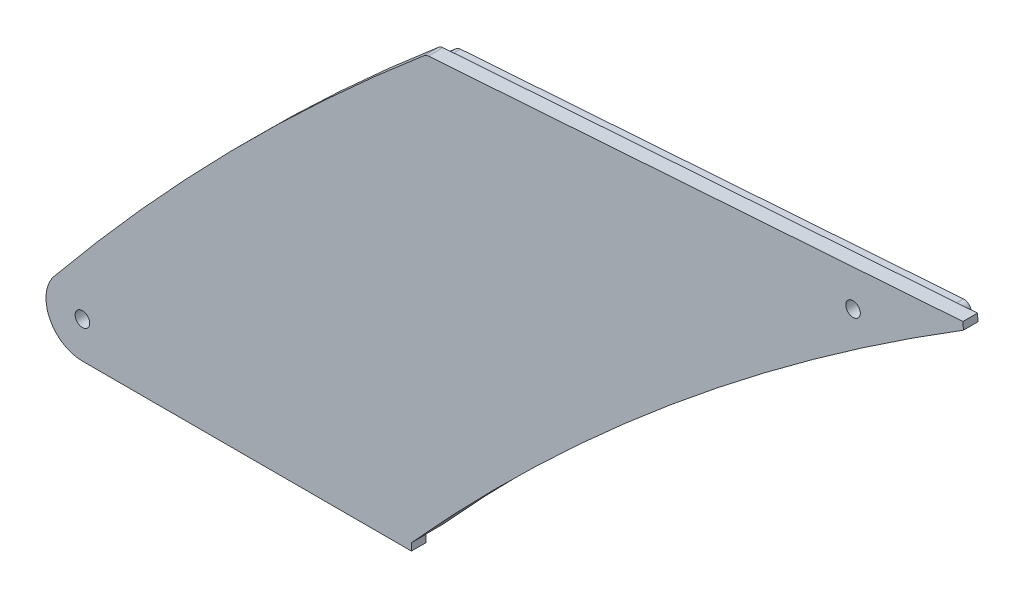
ISO-10303-21;
HEADER;
FILE_DESCRIPTION(('STEP AP214'),'2;1');
FILE_NAME('part.step','',(''),(''),'','','');
FILE_SCHEMA(('AUTOMOTIVE_DESIGN { 1 0 10303 214 1 1 1 1 }'));
ENDSEC;
DATA;
#1=APPLICATION_CONTEXT('core data for automotive mechanical design processes');
#2=APPLICATION_PROTOCOL_DEFINITION('international standard','automotive_design',2000,#1);
#3=PRODUCT_CONTEXT('',#1,'mechanical');
#4=PRODUCT('Part','Part','',(#3));
#5=PRODUCT_RELATED_PRODUCT_CATEGORY('part','',(#4));
#6=PRODUCT_DEFINITION_FORMATION('','',#4);
#7=PRODUCT_DEFINITION_CONTEXT('part definition',#1,'design');
#8=PRODUCT_DEFINITION('design','',#6,#7);
#9=PRODUCT_DEFINITION_SHAPE('','',#8);
#10=(LENGTH_UNIT() NAMED_UNIT(*) SI_UNIT(.MILLI.,.METRE.));
#11=(NAMED_UNIT(*) PLANE_ANGLE_UNIT() SI_UNIT($,.RADIAN.));
#12=(NAMED_UNIT(*) SI_UNIT($,.STERADIAN.) SOLID_ANGLE_UNIT());
#13=UNCERTAINTY_MEASURE_WITH_UNIT(LENGTH_MEASURE(1.E-05),#10,'distance_accuracy_value','');
#14=(GEOMETRIC_REPRESENTATION_CONTEXT(3) GLOBAL_UNCERTAINTY_ASSIGNED_CONTEXT((#13)) GLOBAL_UNIT_ASSIGNED_CONTEXT((#10,
#11,#12)) REPRESENTATION_CONTEXT('',''));
#15=CARTESIAN_POINT('',(0.,0.,0.));
#16=DIRECTION('',(0.,0.,1.));
#17=DIRECTION('',(1.,0.,0.));
#18=AXIS2_PLACEMENT_3D('',#15,#16,#17);
#19=CARTESIAN_POINT('',(-2.4436486294126,-58.,2.));
#20=DIRECTION('',(0.,0.,1.));
#21=DIRECTION('',(1.,0.,0.));
#22=AXIS2_PLACEMENT_3D('',#19,#20,#21);
#23=PLANE('',#22);
#24=CARTESIAN_POINT('',(-2.4436486294126,-58.,2.));
#25=DIRECTION('',(0.,0.,1.));
#26=DIRECTION('',(1.,0.,0.));
#27=AXIS2_PLACEMENT_3D('',#24,#25,#26);
#28=CIRCLE('',#27,1.00000000000001);
#29=CARTESIAN_POINT('',(-2.4436486294126,-59.,2.));
#30=VERTEX_POINT('',#29);
#31=CARTESIAN_POINT('',(-1.70269549343666,-58.6715567364619,2.));
#32=VERTEX_POINT('',#31);
#33=EDGE_CURVE('E255',#30,#32,#28,.T.);
#34=ORIENTED_EDGE('',*,*,#33,.F.);
#35=DIRECTION('',(1.,0.,0.));
#36=VECTOR('',#35,1.);
#37=CARTESIAN_POINT('',(-47.1687635097815,-59.,2.));
#38=LINE('',#37,#36);
#39=CARTESIAN_POINT('',(-47.1687635097815,-59.,2.));
#40=VERTEX_POINT('',#39);
#41=EDGE_CURVE('E260',#40,#30,#38,.T.);
#42=ORIENTED_EDGE('',*,*,#41,.F.);
#43=CARTESIAN_POINT('',(-47.1687635097815,-55.,2.));
#44=DIRECTION('',(0.,0.,1.));
#45=DIRECTION('',(1.,0.,0.));
#46=AXIS2_PLACEMENT_3D('',#43,#44,#45);
#47=CIRCLE('',#46,4.00000000000002);
#48=CARTESIAN_POINT('',(-50.26232758474,-52.4642828797111,2.));
#49=VERTEX_POINT('',#48);
#50=EDGE_CURVE('E291',#49,#40,#47,.T.);
#51=ORIENTED_EDGE('',*,*,#50,.F.);
#52=CARTESIAN_POINT('',(258.320688892371,-305.402065628526,2.));
#53=DIRECTION('',(0.,0.,1.));
#54=DIRECTION('',(1.,0.,0.));
#55=AXIS2_PLACEMENT_3D('',#52,#53,#54);
#56=CIRCLE('',#55,399.);
#57=CARTESIAN_POINT('',(0.145969905223198,-1.18698632457875,2.));
#58=VERTEX_POINT('',#57);
#59=EDGE_CURVE('E289',#58,#49,#56,.T.);
#60=ORIENTED_EDGE('',*,*,#59,.F.);
#61=CARTESIAN_POINT('',(0.7930243387749,-1.94943013235809,2.));
#62=DIRECTION('',(0.,0.,1.));
#63=DIRECTION('',(1.,0.,0.));
#64=AXIS2_PLACEMENT_3D('',#61,#62,#63);
#65=CIRCLE('',#64,0.999999999999972);
#66=CARTESIAN_POINT('',(0.723267865030791,-0.951866082098294,2.));
#67=VERTEX_POINT('',#66);
#68=EDGE_CURVE('E287',#67,#58,#65,.T.);
#69=ORIENTED_EDGE('',*,*,#68,.F.);
#70=DIRECTION('',(-0.997564050259824,-0.069756473744126,0.));
#71=VECTOR('',#70,1.);
#72=CARTESIAN_POINT('',(69.7934844215764,3.87799396194877,2.));
#73=LINE('',#72,#71);
#74=CARTESIAN_POINT('',(69.7934844215764,3.87799396194877,2.));
#75=VERTEX_POINT('',#74);
#76=EDGE_CURVE('E285',#75,#67,#73,.T.);
#77=ORIENTED_EDGE('',*,*,#76,.F.);
#78=CARTESIAN_POINT('',(69.8632408953205,2.88042991168902,2.));
#79=DIRECTION('',(0.,0.,1.));
#80=DIRECTION('',(1.,0.,0.));
#81=AXIS2_PLACEMENT_3D('',#78,#79,#80);
#82=CIRCLE('',#81,0.999999999999983);
#83=CARTESIAN_POINT('',(70.3987767315104,2.03591740843259,2.));
#84=VERTEX_POINT('',#83);
#85=EDGE_CURVE('E283',#84,#75,#82,.T.);
#86=ORIENTED_EDGE('',*,*,#85,.F.);
#87=CARTESIAN_POINT('',(258.371855234146,-294.387971234575,2.));
#88=DIRECTION('',(0.,0.,-1.));
#89=DIRECTION('',(1.,0.,0.));
#90=AXIS2_PLACEMENT_3D('',#87,#88,#89);
#91=CIRCLE('',#90,351.);
#92=EDGE_CURVE('E281',#32,#84,#91,.T.);
#93=ORIENTED_EDGE('',*,*,#92,.F.);
#94=EDGE_LOOP('',(#34,#42,#51,#60,#69,#77,#86,#93));
#95=FACE_BOUND('',#94,.T.);
#96=CARTESIAN_POINT('',(258.371855234146,-294.387971234575,2.));
#97=DIRECTION('',(0.,0.,-1.));
#98=DIRECTION('',(1.,0.,0.));
#99=AXIS2_PLACEMENT_3D('',#96,#97,#98);
#100=CIRCLE('',#99,352.);
#101=CARTESIAN_POINT('',(-1.85015545632594,-57.3468246962405,2.));
#102=VERTEX_POINT('',#101);
#103=CARTESIAN_POINT('',(63.3983515075853,-1.31915193680487,2.));
#104=VERTEX_POINT('',#103);
#105=EDGE_CURVE('E230',#102,#104,#100,.T.);
#106=ORIENTED_EDGE('',*,*,#105,.T.);
#107=CARTESIAN_POINT('',(62.290547509139,0.346011809205182,2.));
#108=DIRECTION('',(0.,0.,1.));
#109=DIRECTION('',(1.,0.,0.));
#110=AXIS2_PLACEMENT_3D('',#107,#108,#109);
#111=CIRCLE('',#110,2.);
#112=CARTESIAN_POINT('',(62.1510345616507,2.34113990972488,2.));
#113=VERTEX_POINT('',#112);
#114=EDGE_CURVE('E11',#104,#113,#111,.T.);
#115=ORIENTED_EDGE('',*,*,#114,.T.);
#116=DIRECTION('',(-0.997564050259824,-0.0697564737441236,0.));
#117=VECTOR('',#116,1.);
#118=CARTESIAN_POINT('',(69.8632408953205,2.88042991168895,2.));
#119=LINE('',#118,#117);
#120=CARTESIAN_POINT('',(1.44835692424686,-1.90360481389329,2.));
#121=VERTEX_POINT('',#120);
#122=EDGE_CURVE('E218',#113,#121,#119,.T.);
#123=ORIENTED_EDGE('',*,*,#122,.T.);
#124=CARTESIAN_POINT('',(1.58786987173512,-3.898732914413,2.));
#125=DIRECTION('',(0.,0.,1.));
#126=DIRECTION('',(1.,0.,0.));
#127=AXIS2_PLACEMENT_3D('',#124,#125,#126);
#128=CIRCLE('',#127,2.);
#129=CARTESIAN_POINT('',(0.291239472641036,-2.37598880979623,2.));
#130=VERTEX_POINT('',#129);
#131=EDGE_CURVE('E41',#121,#130,#128,.T.);
#132=ORIENTED_EDGE('',*,*,#131,.T.);
#133=CARTESIAN_POINT('',(258.320688892371,-305.402065628526,2.));
#134=DIRECTION('',(0.,0.,1.));
#135=DIRECTION('',(1.,0.,0.));
#136=AXIS2_PLACEMENT_3D('',#133,#134,#135);
#137=CIRCLE('',#136,398.);
#138=CARTESIAN_POINT('',(-49.4889365660004,-53.0982121597833,2.));
#139=VERTEX_POINT('',#138);
#140=EDGE_CURVE('E220',#130,#139,#137,.T.);
#141=ORIENTED_EDGE('',*,*,#140,.T.);
#142=CARTESIAN_POINT('',(-47.1687635097815,-55.,2.));
#143=DIRECTION('',(0.,0.,1.));
#144=DIRECTION('',(1.,0.,0.));
#145=AXIS2_PLACEMENT_3D('',#142,#143,#144);
#146=CIRCLE('',#145,3.00000000000002);
#147=CARTESIAN_POINT('',(-47.1687635097815,-58.,2.));
#148=VERTEX_POINT('',#147);
#149=EDGE_CURVE('E243',#139,#148,#146,.T.);
#150=ORIENTED_EDGE('',*,*,#149,.T.);
#151=DIRECTION('',(1.,0.,0.));
#152=VECTOR('',#151,1.);
#153=CARTESIAN_POINT('',(-47.1687635097815,-58.,2.));
#154=LINE('',#153,#152);
#155=CARTESIAN_POINT('',(-3.32868960797633,-58.,2.));
#156=VERTEX_POINT('',#155);
#157=EDGE_CURVE('E246',#148,#156,#154,.T.);
#158=ORIENTED_EDGE('',*,*,#157,.T.);
#159=CARTESIAN_POINT('',(-3.32868960797633,-56.,2.));
#160=DIRECTION('',(0.,0.,1.));
#161=DIRECTION('',(1.,0.,0.));
#162=AXIS2_PLACEMENT_3D('',#159,#160,#161);
#163=CIRCLE('',#162,2.);
#164=EDGE_CURVE('E337',#156,#102,#163,.T.);
#165=ORIENTED_EDGE('',*,*,#164,.T.);
#166=EDGE_LOOP('',(#106,#115,#123,#132,#141,#150,#158,#165));
#167=FACE_BOUND('',#166,.T.);
#168=ADVANCED_FACE('F33',(#95,#167),#23,.F.);
#169=CARTESIAN_POINT('',(-2.4436486294126,-58.,4.));
#170=DIRECTION('',(0.,0.,-1.));
#171=DIRECTION('',(-1.,0.,0.));
#172=AXIS2_PLACEMENT_3D('',#169,#170,#171);
#173=CYLINDRICAL_SURFACE('',#172,1.00000000000001);
#174=ORIENTED_EDGE('',*,*,#33,.T.);
#175=DIRECTION('',(0.,0.,-1.));
#176=VECTOR('',#175,1.);
#177=CARTESIAN_POINT('',(-1.70269549343666,-58.6715567364619,4.));
#178=LINE('',#177,#176);
#179=CARTESIAN_POINT('',(-1.70269549343666,-58.6715567364619,4.));
#180=VERTEX_POINT('',#179);
#181=EDGE_CURVE('E314',#180,#32,#178,.T.);
#182=ORIENTED_EDGE('',*,*,#181,.F.);
#183=CARTESIAN_POINT('',(-2.4436486294126,-58.,4.));
#184=DIRECTION('',(0.,0.,1.));
#185=DIRECTION('',(1.,0.,0.));
#186=AXIS2_PLACEMENT_3D('',#183,#184,#185);
#187=CIRCLE('',#186,1.00000000000001);
#188=CARTESIAN_POINT('',(-2.4436486294126,-59.,4.));
#189=VERTEX_POINT('',#188);
#190=EDGE_CURVE('E256',#189,#180,#187,.T.);
#191=ORIENTED_EDGE('',*,*,#190,.F.);
#192=DIRECTION('',(0.,0.,-1.));
#193=VECTOR('',#192,1.);
#194=CARTESIAN_POINT('',(-2.4436486294126,-59.,4.));
#195=LINE('',#194,#193);
#196=EDGE_CURVE('E278',#189,#30,#195,.T.);
#197=ORIENTED_EDGE('',*,*,#196,.T.);
#198=EDGE_LOOP('',(#174,#182,#191,#197));
#199=FACE_BOUND('',#198,.T.);
#200=ADVANCED_FACE('F375',(#199),#173,.T.);
#201=CARTESIAN_POINT('',(258.371855234146,-294.387971234575,4.));
#202=DIRECTION('',(0.,0.,-1.));
#203=DIRECTION('',(-1.,0.,0.));
#204=AXIS2_PLACEMENT_3D('',#201,#202,#203);
#205=CYLINDRICAL_SURFACE('',#204,351.);
#206=ORIENTED_EDGE('',*,*,#92,.T.);
#207=DIRECTION('',(0.,0.,-1.));
#208=VECTOR('',#207,1.);
#209=CARTESIAN_POINT('',(70.3987767315104,2.03591740843259,4.));
#210=LINE('',#209,#208);
#211=CARTESIAN_POINT('',(70.3987767315104,2.03591740843259,4.));
#212=VERTEX_POINT('',#211);
#213=EDGE_CURVE('E311',#212,#84,#210,.T.);
#214=ORIENTED_EDGE('',*,*,#213,.F.);
#215=CARTESIAN_POINT('',(258.371855234146,-294.387971234575,4.));
#216=DIRECTION('',(0.,0.,-1.));
#217=DIRECTION('',(1.,0.,0.));
#218=AXIS2_PLACEMENT_3D('',#215,#216,#217);
#219=CIRCLE('',#218,351.);
#220=CARTESIAN_POINT('',(73.7864397832826,4.15720860062557,4.));
#221=VERTEX_POINT('',#220);
#222=EDGE_CURVE('E675',#212,#221,#219,.T.);
#223=ORIENTED_EDGE('',*,*,#222,.T.);
#224=DIRECTION('',(0.,0.,-1.));
#225=VECTOR('',#224,1.);
#226=CARTESIAN_POINT('',(73.7864397832826,4.15720860062557,6.));
#227=LINE('',#226,#225);
#228=CARTESIAN_POINT('',(73.7864397832826,4.15720860062557,6.));
#229=VERTEX_POINT('',#228);
#230=EDGE_CURVE('E686',#229,#221,#227,.T.);
#231=ORIENTED_EDGE('',*,*,#230,.F.);
#232=CARTESIAN_POINT('',(258.371855234146,-294.387971234575,6.));
#233=DIRECTION('',(0.,0.,-1.));
#234=DIRECTION('',(1.,0.,0.));
#235=AXIS2_PLACEMENT_3D('',#232,#233,#234);
#236=CIRCLE('',#235,351.);
#237=CARTESIAN_POINT('',(-2.,-59.,6.));
#238=VERTEX_POINT('',#237);
#239=EDGE_CURVE('E660',#238,#229,#236,.T.);
#240=ORIENTED_EDGE('',*,*,#239,.F.);
#241=DIRECTION('',(0.,0.,-1.));
#242=VECTOR('',#241,1.);
#243=CARTESIAN_POINT('',(-2.,-59.,6.));
#244=LINE('',#243,#242);
#245=CARTESIAN_POINT('',(-2.,-59.,4.));
#246=VERTEX_POINT('',#245);
#247=EDGE_CURVE('E689',#238,#246,#244,.T.);
#248=ORIENTED_EDGE('',*,*,#247,.T.);
#249=EDGE_CURVE('E676',#246,#180,#219,.T.);
#250=ORIENTED_EDGE('',*,*,#249,.T.);
#251=ORIENTED_EDGE('',*,*,#181,.T.);
#252=EDGE_LOOP('',(#206,#214,#223,#231,#240,#248,#250,#251));
#253=FACE_BOUND('',#252,.T.);
#254=ADVANCED_FACE('F381',(#253),#205,.F.);
#255=CARTESIAN_POINT('',(69.8632408953205,2.88042991168902,4.));
#256=DIRECTION('',(0.,0.,-1.));
#257=DIRECTION('',(-1.,0.,0.));
#258=AXIS2_PLACEMENT_3D('',#255,#256,#257);
#259=CYLINDRICAL_SURFACE('',#258,0.999999999999983);
#260=ORIENTED_EDGE('',*,*,#85,.T.);
#261=DIRECTION('',(0.,0.,-1.));
#262=VECTOR('',#261,1.);
#263=CARTESIAN_POINT('',(69.7934844215764,3.87799396194877,4.));
#264=LINE('',#263,#262);
#265=CARTESIAN_POINT('',(69.7934844215764,3.87799396194877,4.));
#266=VERTEX_POINT('',#265);
#267=EDGE_CURVE('E308',#266,#75,#264,.T.);
#268=ORIENTED_EDGE('',*,*,#267,.F.);
#269=CARTESIAN_POINT('',(69.8632408953205,2.88042991168902,4.));
#270=DIRECTION('',(0.,0.,1.));
#271=DIRECTION('',(1.,0.,0.));
#272=AXIS2_PLACEMENT_3D('',#269,#270,#271);
#273=CIRCLE('',#272,0.999999999999983);
#274=EDGE_CURVE('E259',#212,#266,#273,.T.);
#275=ORIENTED_EDGE('',*,*,#274,.F.);
#276=ORIENTED_EDGE('',*,*,#213,.T.);
#277=EDGE_LOOP('',(#260,#268,#275,#276));
#278=FACE_BOUND('',#277,.T.);
#279=ADVANCED_FACE('F407',(#278),#259,.T.);
#280=CARTESIAN_POINT('',(69.7934844215764,3.87799396194877,4.));
#281=DIRECTION('',(0.069756473744126,-0.997564050259824,0.));
#282=DIRECTION('',(0.997564050259824,0.069756473744126,0.));
#283=AXIS2_PLACEMENT_3D('',#280,#281,#282);
#284=PLANE('',#283);
#285=ORIENTED_EDGE('',*,*,#76,.T.);
#286=DIRECTION('',(0.,0.,-1.));
#287=VECTOR('',#286,1.);
#288=CARTESIAN_POINT('',(0.723267865030791,-0.951866082098294,4.));
#289=LINE('',#288,#287);
#290=CARTESIAN_POINT('',(0.723267865030791,-0.951866082098294,4.));
#291=VERTEX_POINT('',#290);
#292=EDGE_CURVE('E305',#291,#67,#289,.T.);
#293=ORIENTED_EDGE('',*,*,#292,.F.);
#294=DIRECTION('',(-0.997564050259824,-0.069756473744126,0.));
#295=VECTOR('',#294,1.);
#296=CARTESIAN_POINT('',(69.7934844215764,3.87799396194877,4.));
#297=LINE('',#296,#295);
#298=EDGE_CURVE('E263',#266,#291,#297,.T.);
#299=ORIENTED_EDGE('',*,*,#298,.F.);
#300=ORIENTED_EDGE('',*,*,#267,.T.);
#301=EDGE_LOOP('',(#285,#293,#299,#300));
#302=FACE_BOUND('',#301,.T.);
#303=ADVANCED_FACE('F403',(#302),#284,.F.);
#304=CARTESIAN_POINT('',(0.7930243387749,-1.94943013235809,4.));
#305=DIRECTION('',(0.,0.,-1.));
#306=DIRECTION('',(-1.,0.,0.));
#307=AXIS2_PLACEMENT_3D('',#304,#305,#306);
#308=CYLINDRICAL_SURFACE('',#307,0.999999999999972);
#309=ORIENTED_EDGE('',*,*,#68,.T.);
#310=DIRECTION('',(0.,0.,-1.));
#311=VECTOR('',#310,1.);
#312=CARTESIAN_POINT('',(0.145969905223198,-1.18698632457875,4.));
#313=LINE('',#312,#311);
#314=CARTESIAN_POINT('',(0.145969905223198,-1.18698632457875,4.));
#315=VERTEX_POINT('',#314);
#316=EDGE_CURVE('E302',#315,#58,#313,.T.);
#317=ORIENTED_EDGE('',*,*,#316,.F.);
#318=CARTESIAN_POINT('',(0.7930243387749,-1.94943013235809,4.));
#319=DIRECTION('',(0.,0.,1.));
#320=DIRECTION('',(1.,0.,0.));
#321=AXIS2_PLACEMENT_3D('',#318,#319,#320);
#322=CIRCLE('',#321,0.999999999999972);
#323=EDGE_CURVE('E266',#291,#315,#322,.T.);
#324=ORIENTED_EDGE('',*,*,#323,.F.);
#325=ORIENTED_EDGE('',*,*,#292,.T.);
#326=EDGE_LOOP('',(#309,#317,#324,#325));
#327=FACE_BOUND('',#326,.T.);
#328=ADVANCED_FACE('F399',(#327),#308,.T.);
#329=CARTESIAN_POINT('',(258.320688892371,-305.402065628526,4.));
#330=DIRECTION('',(0.,0.,-1.));
#331=DIRECTION('',(-1.,0.,0.));
#332=AXIS2_PLACEMENT_3D('',#329,#330,#331);
#333=CYLINDRICAL_SURFACE('',#332,399.);
#334=ORIENTED_EDGE('',*,*,#59,.T.);
#335=DIRECTION('',(0.,0.,-1.));
#336=VECTOR('',#335,1.);
#337=CARTESIAN_POINT('',(-50.26232758474,-52.4642828797111,4.));
#338=LINE('',#337,#336);
#339=CARTESIAN_POINT('',(-50.26232758474,-52.4642828797111,4.));
#340=VERTEX_POINT('',#339);
#341=EDGE_CURVE('E299',#340,#49,#338,.T.);
#342=ORIENTED_EDGE('',*,*,#341,.F.);
#343=CARTESIAN_POINT('',(258.320688892371,-305.402065628526,4.));
#344=DIRECTION('',(0.,0.,1.));
#345=DIRECTION('',(1.,0.,0.));
#346=AXIS2_PLACEMENT_3D('',#343,#344,#345);
#347=CIRCLE('',#346,399.);
#348=EDGE_CURVE('E269',#315,#340,#347,.T.);
#349=ORIENTED_EDGE('',*,*,#348,.F.);
#350=ORIENTED_EDGE('',*,*,#316,.T.);
#351=EDGE_LOOP('',(#334,#342,#349,#350));
#352=FACE_BOUND('',#351,.T.);
#353=ADVANCED_FACE('F395',(#352),#333,.T.);
#354=CARTESIAN_POINT('',(-47.1687635097815,-55.,4.));
#355=DIRECTION('',(0.,0.,-1.));
#356=DIRECTION('',(-1.,0.,0.));
#357=AXIS2_PLACEMENT_3D('',#354,#355,#356);
#358=CYLINDRICAL_SURFACE('',#357,4.00000000000002);
#359=ORIENTED_EDGE('',*,*,#50,.T.);
#360=DIRECTION('',(0.,0.,-1.));
#361=VECTOR('',#360,1.);
#362=CARTESIAN_POINT('',(-47.1687635097815,-59.,4.));
#363=LINE('',#362,#361);
#364=CARTESIAN_POINT('',(-47.1687635097815,-59.,4.));
#365=VERTEX_POINT('',#364);
#366=EDGE_CURVE('E296',#365,#40,#363,.T.);
#367=ORIENTED_EDGE('',*,*,#366,.F.);
#368=CARTESIAN_POINT('',(-47.1687635097815,-55.,4.));
#369=DIRECTION('',(0.,0.,1.));
#370=DIRECTION('',(1.,0.,0.));
#371=AXIS2_PLACEMENT_3D('',#368,#369,#370);
#372=CIRCLE('',#371,4.00000000000002);
#373=EDGE_CURVE('E272',#340,#365,#372,.T.);
#374=ORIENTED_EDGE('',*,*,#373,.F.);
#375=ORIENTED_EDGE('',*,*,#341,.T.);
#376=EDGE_LOOP('',(#359,#367,#374,#375));
#377=FACE_BOUND('',#376,.T.);
#378=ADVANCED_FACE('F391',(#377),#358,.T.);
#379=CARTESIAN_POINT('',(-47.1687635097815,-59.,4.));
#380=DIRECTION('',(0.,1.,0.));
#381=DIRECTION('',(0.,0.,1.));
#382=AXIS2_PLACEMENT_3D('',#379,#380,#381);
#383=PLANE('',#382);
#384=ORIENTED_EDGE('',*,*,#41,.T.);
#385=ORIENTED_EDGE('',*,*,#196,.F.);
#386=DIRECTION('',(1.,0.,0.));
#387=VECTOR('',#386,1.);
#388=CARTESIAN_POINT('',(-47.1687635097815,-59.,4.));
#389=LINE('',#388,#387);
#390=EDGE_CURVE('E275',#365,#189,#389,.T.);
#391=ORIENTED_EDGE('',*,*,#390,.F.);
#392=ORIENTED_EDGE('',*,*,#366,.T.);
#393=EDGE_LOOP('',(#384,#385,#391,#392));
#394=FACE_BOUND('',#393,.T.);
#395=ADVANCED_FACE('F388',(#394),#383,.F.);
#396=CARTESIAN_POINT('',(69.8632408953205,2.88042991168895,4.));
#397=DIRECTION('',(0.0697564737441236,-0.997564050259824,0.));
#398=DIRECTION('',(0.997564050259825,0.0697564737441237,0.));
#399=AXIS2_PLACEMENT_3D('',#396,#397,#398);
#400=PLANE('',#399);
#401=DIRECTION('',(-0.997564050259824,-0.0697564737441236,0.));
#402=VECTOR('',#401,1.);
#403=CARTESIAN_POINT('',(69.8632408953205,2.88042991168895,4.));
#404=LINE('',#403,#402);
#405=CARTESIAN_POINT('',(62.1510345616507,2.34113990972488,4.));
#406=VERTEX_POINT('',#405);
#407=CARTESIAN_POINT('',(1.44835692424686,-1.90360481389329,4.));
#408=VERTEX_POINT('',#407);
#409=EDGE_CURVE('E226',#406,#408,#404,.T.);
#410=ORIENTED_EDGE('',*,*,#409,.T.);
#411=DIRECTION('',(0.,0.,1.));
#412=VECTOR('',#411,1.);
#413=CARTESIAN_POINT('',(1.44835692424687,-1.90360481389329,2.));
#414=LINE('',#413,#412);
#415=EDGE_CURVE('E333',#408,#121,#414,.F.);
#416=ORIENTED_EDGE('',*,*,#415,.T.);
#417=ORIENTED_EDGE('',*,*,#122,.F.);
#418=DIRECTION('',(0.,0.,1.));
#419=VECTOR('',#418,1.);
#420=CARTESIAN_POINT('',(62.1510345616507,2.34113990972488,4.));
#421=LINE('',#420,#419);
#422=EDGE_CURVE('E331',#113,#406,#421,.T.);
#423=ORIENTED_EDGE('',*,*,#422,.T.);
#424=EDGE_LOOP('',(#410,#416,#417,#423));
#425=FACE_BOUND('',#424,.T.);
#426=ADVANCED_FACE('F366',(#425),#400,.T.);
#427=CARTESIAN_POINT('',(258.320688892371,-305.402065628526,4.));
#428=DIRECTION('',(0.,0.,-1.));
#429=DIRECTION('',(-1.,0.,0.));
#430=AXIS2_PLACEMENT_3D('',#427,#428,#429);
#431=CYLINDRICAL_SURFACE('',#430,398.);
#432=ORIENTED_EDGE('',*,*,#140,.F.);
#433=DIRECTION('',(0.,0.,-1.));
#434=VECTOR('',#433,1.);
#435=CARTESIAN_POINT('',(0.291239472641036,-2.37598880979623,4.));
#436=LINE('',#435,#434);
#437=CARTESIAN_POINT('',(0.291239472641036,-2.37598880979623,4.));
#438=VERTEX_POINT('',#437);
#439=EDGE_CURVE('E335',#130,#438,#436,.F.);
#440=ORIENTED_EDGE('',*,*,#439,.T.);
#441=CARTESIAN_POINT('',(258.320688892371,-305.402065628526,4.));
#442=DIRECTION('',(0.,0.,1.));
#443=DIRECTION('',(1.,0.,0.));
#444=AXIS2_PLACEMENT_3D('',#441,#442,#443);
#445=CIRCLE('',#444,398.);
#446=CARTESIAN_POINT('',(-49.4889365660004,-53.0982121597833,4.));
#447=VERTEX_POINT('',#446);
#448=EDGE_CURVE('E229',#438,#447,#445,.T.);
#449=ORIENTED_EDGE('',*,*,#448,.T.);
#450=DIRECTION('',(0.,0.,-1.));
#451=VECTOR('',#450,1.);
#452=CARTESIAN_POINT('',(-49.4889365660004,-53.0982121597833,4.));
#453=LINE('',#452,#451);
#454=EDGE_CURVE('E252',#447,#139,#453,.T.);
#455=ORIENTED_EDGE('',*,*,#454,.T.);
#456=EDGE_LOOP('',(#432,#440,#449,#455));
#457=FACE_BOUND('',#456,.T.);
#458=ADVANCED_FACE('F467',(#457),#431,.F.);
#459=CARTESIAN_POINT('',(-47.1687635097815,-55.,4.));
#460=DIRECTION('',(0.,0.,-1.));
#461=DIRECTION('',(-1.,0.,0.));
#462=AXIS2_PLACEMENT_3D('',#459,#460,#461);
#463=CYLINDRICAL_SURFACE('',#462,3.00000000000002);
#464=ORIENTED_EDGE('',*,*,#149,.F.);
#465=ORIENTED_EDGE('',*,*,#454,.F.);
#466=CARTESIAN_POINT('',(-47.1687635097815,-55.,4.));
#467=DIRECTION('',(0.,0.,1.));
#468=DIRECTION('',(1.,0.,0.));
#469=AXIS2_PLACEMENT_3D('',#466,#467,#468);
#470=CIRCLE('',#469,3.00000000000002);
#471=CARTESIAN_POINT('',(-47.1687635097815,-58.,4.));
#472=VERTEX_POINT('',#471);
#473=EDGE_CURVE('E232',#447,#472,#470,.T.);
#474=ORIENTED_EDGE('',*,*,#473,.T.);
#475=DIRECTION('',(0.,0.,-1.));
#476=VECTOR('',#475,1.);
#477=CARTESIAN_POINT('',(-47.1687635097815,-58.,4.));
#478=LINE('',#477,#476);
#479=EDGE_CURVE('E240',#472,#148,#478,.T.);
#480=ORIENTED_EDGE('',*,*,#479,.T.);
#481=EDGE_LOOP('',(#464,#465,#474,#480));
#482=FACE_BOUND('',#481,.T.);
#483=ADVANCED_FACE('F357',(#482),#463,.F.);
#484=CARTESIAN_POINT('',(-47.1687635097815,-58.,4.));
#485=DIRECTION('',(0.,1.,0.));
#486=DIRECTION('',(-1.,0.,0.));
#487=AXIS2_PLACEMENT_3D('',#484,#485,#486);
#488=PLANE('',#487);
#489=DIRECTION('',(1.,0.,0.));
#490=VECTOR('',#489,1.);
#491=CARTESIAN_POINT('',(-47.1687635097815,-58.,4.));
#492=LINE('',#491,#490);
#493=CARTESIAN_POINT('',(-3.32868960797633,-58.,4.));
#494=VERTEX_POINT('',#493);
#495=EDGE_CURVE('E235',#472,#494,#492,.T.);
#496=ORIENTED_EDGE('',*,*,#495,.T.);
#497=DIRECTION('',(0.,0.,1.));
#498=VECTOR('',#497,1.);
#499=CARTESIAN_POINT('',(-3.32868960797633,-58.,2.));
#500=LINE('',#499,#498);
#501=EDGE_CURVE('E317',#494,#156,#500,.F.);
#502=ORIENTED_EDGE('',*,*,#501,.T.);
#503=ORIENTED_EDGE('',*,*,#157,.F.);
#504=ORIENTED_EDGE('',*,*,#479,.F.);
#505=EDGE_LOOP('',(#496,#502,#503,#504));
#506=FACE_BOUND('',#505,.T.);
#507=ADVANCED_FACE('F354',(#506),#488,.T.);
#508=CARTESIAN_POINT('',(258.371855234146,-294.387971234575,4.));
#509=DIRECTION('',(0.,0.,-1.));
#510=DIRECTION('',(-1.,0.,0.));
#511=AXIS2_PLACEMENT_3D('',#508,#509,#510);
#512=CYLINDRICAL_SURFACE('',#511,352.);
#513=ORIENTED_EDGE('',*,*,#105,.F.);
#514=DIRECTION('',(0.,0.,-1.));
#515=VECTOR('',#514,1.);
#516=CARTESIAN_POINT('',(-1.85015545632594,-57.3468246962405,4.));
#517=LINE('',#516,#515);
#518=CARTESIAN_POINT('',(-1.85015545632594,-57.3468246962405,4.));
#519=VERTEX_POINT('',#518);
#520=EDGE_CURVE('E323',#102,#519,#517,.F.);
#521=ORIENTED_EDGE('',*,*,#520,.T.);
#522=CARTESIAN_POINT('',(258.371855234146,-294.387971234575,4.));
#523=DIRECTION('',(0.,0.,-1.));
#524=DIRECTION('',(1.,0.,0.));
#525=AXIS2_PLACEMENT_3D('',#522,#523,#524);
#526=CIRCLE('',#525,352.);
#527=CARTESIAN_POINT('',(63.3983515075853,-1.31915193680487,4.));
#528=VERTEX_POINT('',#527);
#529=EDGE_CURVE('E238',#519,#528,#526,.T.);
#530=ORIENTED_EDGE('',*,*,#529,.T.);
#531=DIRECTION('',(0.,0.,-1.));
#532=VECTOR('',#531,1.);
#533=CARTESIAN_POINT('',(63.3983515075853,-1.31915193680487,4.));
#534=LINE('',#533,#532);
#535=EDGE_CURVE('E320',#528,#104,#534,.T.);
#536=ORIENTED_EDGE('',*,*,#535,.T.);
#537=EDGE_LOOP('',(#513,#521,#530,#536));
#538=FACE_BOUND('',#537,.T.);
#539=ADVANCED_FACE('F344',(#538),#512,.T.);
#540=CARTESIAN_POINT('',(0.396285468752138,-0.974730918631761,4.));
#541=DIRECTION('',(0.,0.,1.));
#542=DIRECTION('',(1.,0.,0.));
#543=AXIS2_PLACEMENT_3D('',#540,#541,#542);
#544=PLANE('',#543);
#545=CARTESIAN_POINT('',(-47.1687635097814,-55.,4.));
#546=DIRECTION('',(0.,0.,1.));
#547=DIRECTION('',(1.,0.,0.));
#548=AXIS2_PLACEMENT_3D('',#545,#546,#547);
#549=CIRCLE('',#548,0.999999999999998);
#550=CARTESIAN_POINT('',(-46.1687635097814,-55.,4.));
#551=VERTEX_POINT('',#550);
#552=EDGE_CURVE('E642',#551,#551,#549,.T.);
#553=ORIENTED_EDGE('',*,*,#552,.T.);
#554=EDGE_LOOP('',(#553));
#555=FACE_BOUND('',#554,.T.);
#556=CARTESIAN_POINT('',(58.6292170166104,-0.91245525769007,4.));
#557=DIRECTION('',(0.,0.,1.));
#558=DIRECTION('',(1.,0.,0.));
#559=AXIS2_PLACEMENT_3D('',#556,#557,#558);
#560=CIRCLE('',#559,0.999999999999998);
#561=CARTESIAN_POINT('',(59.6292170166104,-0.91245525769007,4.));
#562=VERTEX_POINT('',#561);
#563=EDGE_CURVE('E645',#562,#562,#560,.T.);
#564=ORIENTED_EDGE('',*,*,#563,.T.);
#565=EDGE_LOOP('',(#564));
#566=FACE_BOUND('',#565,.T.);
#567=ORIENTED_EDGE('',*,*,#529,.F.);
#568=CARTESIAN_POINT('',(-3.32868960797633,-56.,4.));
#569=DIRECTION('',(0.,0.,1.));
#570=DIRECTION('',(1.,0.,0.));
#571=AXIS2_PLACEMENT_3D('',#568,#569,#570);
#572=CIRCLE('',#571,2.);
#573=EDGE_CURVE('E329',#519,#494,#572,.F.);
#574=ORIENTED_EDGE('',*,*,#573,.T.);
#575=ORIENTED_EDGE('',*,*,#495,.F.);
#576=ORIENTED_EDGE('',*,*,#473,.F.);
#577=ORIENTED_EDGE('',*,*,#448,.F.);
#578=CARTESIAN_POINT('',(1.58786987173512,-3.898732914413,4.));
#579=DIRECTION('',(0.,0.,1.));
#580=DIRECTION('',(1.,0.,0.));
#581=AXIS2_PLACEMENT_3D('',#578,#579,#580);
#582=CIRCLE('',#581,2.);
#583=EDGE_CURVE('E327',#438,#408,#582,.F.);
#584=ORIENTED_EDGE('',*,*,#583,.T.);
#585=ORIENTED_EDGE('',*,*,#409,.F.);
#586=CARTESIAN_POINT('',(62.290547509139,0.346011809205182,4.));
#587=DIRECTION('',(0.,0.,1.));
#588=DIRECTION('',(1.,0.,0.));
#589=AXIS2_PLACEMENT_3D('',#586,#587,#588);
#590=CIRCLE('',#589,2.);
#591=EDGE_CURVE('E325',#406,#528,#590,.F.);
#592=ORIENTED_EDGE('',*,*,#591,.T.);
#593=EDGE_LOOP('',(#567,#574,#575,#576,#577,#584,#585,#592));
#594=FACE_BOUND('',#593,.T.);
#595=ADVANCED_FACE('F350',(#555,#566,#594),#544,.F.);
#596=CARTESIAN_POINT('',(0.396285468752138,-0.974730918631761,6.));
#597=DIRECTION('',(0.,0.,1.));
#598=DIRECTION('',(1.,0.,0.));
#599=AXIS2_PLACEMENT_3D('',#596,#597,#598);
#600=PLANE('',#599);
#601=CARTESIAN_POINT('',(58.6292170166104,-0.91245525769007,6.));
#602=DIRECTION('',(0.,0.,1.));
#603=DIRECTION('',(1.,0.,0.));
#604=AXIS2_PLACEMENT_3D('',#601,#602,#603);
#605=CIRCLE('',#604,0.999999999999998);
#606=CARTESIAN_POINT('',(59.6292170166104,-0.91245525769007,6.));
#607=VERTEX_POINT('',#606);
#608=EDGE_CURVE('E647',#607,#607,#605,.T.);
#609=ORIENTED_EDGE('',*,*,#608,.F.);
#610=EDGE_LOOP('',(#609));
#611=FACE_BOUND('',#610,.T.);
#612=CARTESIAN_POINT('',(0.396285468752138,-0.974730918631761,6.));
#613=DIRECTION('',(0.,0.,1.));
#614=DIRECTION('',(1.,0.,0.));
#615=AXIS2_PLACEMENT_3D('',#612,#613,#614);
#616=CIRCLE('',#615,0.999999999999969);
#617=CARTESIAN_POINT('',(0.326528995008014,0.0228331316280292,6.));
#618=VERTEX_POINT('',#617);
#619=CARTESIAN_POINT('',(-0.250141607497589,-0.211755142416503,6.));
#620=VERTEX_POINT('',#619);
#621=EDGE_CURVE('E203',#618,#620,#616,.T.);
#622=ORIENTED_EDGE('',*,*,#621,.T.);
#623=CARTESIAN_POINT('',(258.320688892371,-305.402065628526,6.));
#624=DIRECTION('',(0.,0.,1.));
#625=DIRECTION('',(1.,0.,0.));
#626=AXIS2_PLACEMENT_3D('',#623,#624,#625);
#627=CIRCLE('',#626,400.);
#628=CARTESIAN_POINT('',(-51.0357186034797,-51.8303535996389,6.));
#629=VERTEX_POINT('',#628);
#630=EDGE_CURVE('E192',#620,#629,#627,.T.);
#631=ORIENTED_EDGE('',*,*,#630,.T.);
#632=CARTESIAN_POINT('',(-47.1687635097815,-55.,6.));
#633=DIRECTION('',(0.,0.,1.));
#634=DIRECTION('',(1.,0.,0.));
#635=AXIS2_PLACEMENT_3D('',#632,#633,#634);
#636=CIRCLE('',#635,5.00000000000002);
#637=CARTESIAN_POINT('',(-47.1687635097815,-60.,6.));
#638=VERTEX_POINT('',#637);
#639=EDGE_CURVE('E202',#629,#638,#636,.T.);
#640=ORIENTED_EDGE('',*,*,#639,.T.);
#641=DIRECTION('',(1.,0.,0.));
#642=VECTOR('',#641,1.);
#643=CARTESIAN_POINT('',(-47.1687635097815,-60.,6.));
#644=LINE('',#643,#642);
#645=CARTESIAN_POINT('',(-1.99999999999999,-60.,6.));
#646=VERTEX_POINT('',#645);
#647=EDGE_CURVE('E656',#638,#646,#644,.T.);
#648=ORIENTED_EDGE('',*,*,#647,.T.);
#649=DIRECTION('',(0.,1.,0.));
#650=VECTOR('',#649,1.);
#651=CARTESIAN_POINT('',(-1.99999999999999,-59.,6.));
#652=LINE('',#651,#650);
#653=EDGE_CURVE('E658',#646,#238,#652,.T.);
#654=ORIENTED_EDGE('',*,*,#653,.T.);
#655=ORIENTED_EDGE('',*,*,#239,.T.);
#656=DIRECTION('',(-0.0697564737441481,0.997564050259823,0.));
#657=VECTOR('',#656,1.);
#658=CARTESIAN_POINT('',(73.7864397832826,4.15720860062557,6.));
#659=LINE('',#658,#657);
#660=CARTESIAN_POINT('',(73.7166833095384,5.15477265088555,6.));
#661=VERTEX_POINT('',#660);
#662=EDGE_CURVE('E662',#229,#661,#659,.T.);
#663=ORIENTED_EDGE('',*,*,#662,.T.);
#664=DIRECTION('',(-0.997564050259824,-0.0697564737441273,0.));
#665=VECTOR('',#664,1.);
#666=CARTESIAN_POINT('',(73.7166833095384,5.15477265088555,6.));
#667=LINE('',#666,#665);
#668=EDGE_CURVE('E209',#661,#618,#667,.T.);
#669=ORIENTED_EDGE('',*,*,#668,.T.);
#670=EDGE_LOOP('',(#622,#631,#640,#648,#654,#655,#663,#669));
#671=FACE_BOUND('',#670,.T.);
#672=CARTESIAN_POINT('',(-47.1687635097814,-55.,6.));
#673=DIRECTION('',(0.,0.,1.));
#674=DIRECTION('',(1.,0.,0.));
#675=AXIS2_PLACEMENT_3D('',#672,#673,#674);
#676=CIRCLE('',#675,0.999999999999998);
#677=CARTESIAN_POINT('',(-46.1687635097814,-55.,6.));
#678=VERTEX_POINT('',#677);
#679=EDGE_CURVE('E648',#678,#678,#676,.T.);
#680=ORIENTED_EDGE('',*,*,#679,.F.);
#681=EDGE_LOOP('',(#680));
#682=FACE_BOUND('',#681,.T.);
#683=ADVANCED_FACE('F206',(#611,#671,#682),#600,.T.);
#684=ORIENTED_EDGE('',*,*,#390,.T.);
#685=ORIENTED_EDGE('',*,*,#190,.T.);
#686=ORIENTED_EDGE('',*,*,#249,.F.);
#687=DIRECTION('',(0.,1.,0.));
#688=VECTOR('',#687,1.);
#689=CARTESIAN_POINT('',(-1.99999999999999,-59.,4.));
#690=LINE('',#689,#688);
#691=CARTESIAN_POINT('',(-1.99999999999999,-60.,4.));
#692=VERTEX_POINT('',#691);
#693=EDGE_CURVE('E673',#692,#246,#690,.T.);
#694=ORIENTED_EDGE('',*,*,#693,.F.);
#695=DIRECTION('',(1.,0.,0.));
#696=VECTOR('',#695,1.);
#697=CARTESIAN_POINT('',(-47.1687635097815,-60.,4.));
#698=LINE('',#697,#696);
#699=CARTESIAN_POINT('',(-47.1687635097815,-60.,4.));
#700=VERTEX_POINT('',#699);
#701=EDGE_CURVE('E671',#700,#692,#698,.T.);
#702=ORIENTED_EDGE('',*,*,#701,.F.);
#703=CARTESIAN_POINT('',(-47.1687635097815,-55.,4.));
#704=DIRECTION('',(0.,0.,1.));
#705=DIRECTION('',(1.,0.,0.));
#706=AXIS2_PLACEMENT_3D('',#703,#704,#705);
#707=CIRCLE('',#706,5.00000000000002);
#708=CARTESIAN_POINT('',(-51.0357186034797,-51.8303535996389,4.));
#709=VERTEX_POINT('',#708);
#710=EDGE_CURVE('E669',#709,#700,#707,.T.);
#711=ORIENTED_EDGE('',*,*,#710,.F.);
#712=CARTESIAN_POINT('',(258.320688892371,-305.402065628526,4.));
#713=DIRECTION('',(0.,0.,1.));
#714=DIRECTION('',(1.,0.,0.));
#715=AXIS2_PLACEMENT_3D('',#712,#713,#714);
#716=CIRCLE('',#715,400.);
#717=CARTESIAN_POINT('',(-0.250141607497589,-0.211755142416503,4.));
#718=VERTEX_POINT('',#717);
#719=EDGE_CURVE('E667',#718,#709,#716,.T.);
#720=ORIENTED_EDGE('',*,*,#719,.F.);
#721=CARTESIAN_POINT('',(0.396285468752138,-0.974730918631761,4.));
#722=DIRECTION('',(0.,0.,1.));
#723=DIRECTION('',(1.,0.,0.));
#724=AXIS2_PLACEMENT_3D('',#721,#722,#723);
#725=CIRCLE('',#724,0.999999999999969);
#726=CARTESIAN_POINT('',(0.326528995008014,0.0228331316280292,4.));
#727=VERTEX_POINT('',#726);
#728=EDGE_CURVE('E217',#727,#718,#725,.T.);
#729=ORIENTED_EDGE('',*,*,#728,.F.);
#730=DIRECTION('',(-0.997564050259824,-0.0697564737441273,0.));
#731=VECTOR('',#730,1.);
#732=CARTESIAN_POINT('',(73.7166833095384,5.15477265088555,4.));
#733=LINE('',#732,#731);
#734=CARTESIAN_POINT('',(73.7166833095384,5.15477265088555,4.));
#735=VERTEX_POINT('',#734);
#736=EDGE_CURVE('E213',#735,#727,#733,.T.);
#737=ORIENTED_EDGE('',*,*,#736,.F.);
#738=DIRECTION('',(-0.0697564737441481,0.997564050259823,0.));
#739=VECTOR('',#738,1.);
#740=CARTESIAN_POINT('',(73.7864397832826,4.15720860062557,4.));
#741=LINE('',#740,#739);
#742=EDGE_CURVE('E679',#221,#735,#741,.T.);
#743=ORIENTED_EDGE('',*,*,#742,.F.);
#744=ORIENTED_EDGE('',*,*,#222,.F.);
#745=ORIENTED_EDGE('',*,*,#274,.T.);
#746=ORIENTED_EDGE('',*,*,#298,.T.);
#747=ORIENTED_EDGE('',*,*,#323,.T.);
#748=ORIENTED_EDGE('',*,*,#348,.T.);
#749=ORIENTED_EDGE('',*,*,#373,.T.);
#750=EDGE_LOOP('',(#684,#685,#686,#694,#702,#711,#720,#729,#737,#743,#744,#745,#746,#747,#748,#749));
#751=FACE_BOUND('',#750,.T.);
#752=ADVANCED_FACE('F434',(#751),#544,.F.);
#753=CARTESIAN_POINT('',(0.396285468752138,-0.974730918631761,6.));
#754=DIRECTION('',(0.,0.,-1.));
#755=DIRECTION('',(-1.,0.,0.));
#756=AXIS2_PLACEMENT_3D('',#753,#754,#755);
#757=CYLINDRICAL_SURFACE('',#756,0.999999999999969);
#758=ORIENTED_EDGE('',*,*,#728,.T.);
#759=DIRECTION('',(0.,0.,-1.));
#760=VECTOR('',#759,1.);
#761=CARTESIAN_POINT('',(-0.250141607497589,-0.211755142416503,6.));
#762=LINE('',#761,#760);
#763=EDGE_CURVE('E196',#620,#718,#762,.T.);
#764=ORIENTED_EDGE('',*,*,#763,.F.);
#765=ORIENTED_EDGE('',*,*,#621,.F.);
#766=DIRECTION('',(0.,0.,-1.));
#767=VECTOR('',#766,1.);
#768=CARTESIAN_POINT('',(0.326528995008014,0.0228331316280292,6.));
#769=LINE('',#768,#767);
#770=EDGE_CURVE('E665',#618,#727,#769,.T.);
#771=ORIENTED_EDGE('',*,*,#770,.T.);
#772=EDGE_LOOP('',(#758,#764,#765,#771));
#773=FACE_BOUND('',#772,.T.);
#774=ADVANCED_FACE('F215',(#773),#757,.T.);
#775=CARTESIAN_POINT('',(258.320688892371,-305.402065628526,6.));
#776=DIRECTION('',(0.,0.,-1.));
#777=DIRECTION('',(-1.,0.,0.));
#778=AXIS2_PLACEMENT_3D('',#775,#776,#777);
#779=CYLINDRICAL_SURFACE('',#778,400.);
#780=ORIENTED_EDGE('',*,*,#719,.T.);
#781=DIRECTION('',(0.,0.,-1.));
#782=VECTOR('',#781,1.);
#783=CARTESIAN_POINT('',(-51.0357186034797,-51.8303535996389,6.));
#784=LINE('',#783,#782);
#785=EDGE_CURVE('E199',#629,#709,#784,.T.);
#786=ORIENTED_EDGE('',*,*,#785,.F.);
#787=ORIENTED_EDGE('',*,*,#630,.F.);
#788=ORIENTED_EDGE('',*,*,#763,.T.);
#789=EDGE_LOOP('',(#780,#786,#787,#788));
#790=FACE_BOUND('',#789,.T.);
#791=ADVANCED_FACE('F194',(#790),#779,.T.);
#792=CARTESIAN_POINT('',(-47.1687635097815,-55.,6.));
#793=DIRECTION('',(0.,0.,-1.));
#794=DIRECTION('',(-1.,0.,0.));
#795=AXIS2_PLACEMENT_3D('',#792,#793,#794);
#796=CYLINDRICAL_SURFACE('',#795,5.00000000000002);
#797=ORIENTED_EDGE('',*,*,#710,.T.);
#798=DIRECTION('',(0.,0.,-1.));
#799=VECTOR('',#798,1.);
#800=CARTESIAN_POINT('',(-47.1687635097815,-60.,6.));
#801=LINE('',#800,#799);
#802=EDGE_CURVE('E222',#638,#700,#801,.T.);
#803=ORIENTED_EDGE('',*,*,#802,.F.);
#804=ORIENTED_EDGE('',*,*,#639,.F.);
#805=ORIENTED_EDGE('',*,*,#785,.T.);
#806=EDGE_LOOP('',(#797,#803,#804,#805));
#807=FACE_BOUND('',#806,.T.);
#808=ADVANCED_FACE('F453',(#807),#796,.T.);
#809=CARTESIAN_POINT('',(-47.1687635097815,-60.,6.));
#810=DIRECTION('',(0.,1.,0.));
#811=DIRECTION('',(-1.,0.,0.));
#812=AXIS2_PLACEMENT_3D('',#809,#810,#811);
#813=PLANE('',#812);
#814=ORIENTED_EDGE('',*,*,#701,.T.);
#815=DIRECTION('',(0.,0.,-1.));
#816=VECTOR('',#815,1.);
#817=CARTESIAN_POINT('',(-1.99999999999999,-60.,6.));
#818=LINE('',#817,#816);
#819=EDGE_CURVE('E692',#646,#692,#818,.T.);
#820=ORIENTED_EDGE('',*,*,#819,.F.);
#821=ORIENTED_EDGE('',*,*,#647,.F.);
#822=ORIENTED_EDGE('',*,*,#802,.T.);
#823=EDGE_LOOP('',(#814,#820,#821,#822));
#824=FACE_BOUND('',#823,.T.);
#825=ADVANCED_FACE('F449',(#824),#813,.F.);
#826=CARTESIAN_POINT('',(-1.99999999999999,-59.,6.));
#827=DIRECTION('',(-1.,0.,0.));
#828=DIRECTION('',(0.,-1.,0.));
#829=AXIS2_PLACEMENT_3D('',#826,#827,#828);
#830=PLANE('',#829);
#831=ORIENTED_EDGE('',*,*,#693,.T.);
#832=ORIENTED_EDGE('',*,*,#247,.F.);
#833=ORIENTED_EDGE('',*,*,#653,.F.);
#834=ORIENTED_EDGE('',*,*,#819,.T.);
#835=EDGE_LOOP('',(#831,#832,#833,#834));
#836=FACE_BOUND('',#835,.T.);
#837=ADVANCED_FACE('F445',(#836),#830,.F.);
#838=CARTESIAN_POINT('',(73.7864397832826,4.15720860062557,6.));
#839=DIRECTION('',(-0.997564050259823,-0.0697564737441481,0.));
#840=DIRECTION('',(0.0697564737441481,-0.997564050259823,0.));
#841=AXIS2_PLACEMENT_3D('',#838,#839,#840);
#842=PLANE('',#841);
#843=ORIENTED_EDGE('',*,*,#742,.T.);
#844=DIRECTION('',(0.,0.,-1.));
#845=VECTOR('',#844,1.);
#846=CARTESIAN_POINT('',(73.7166833095384,5.15477265088555,6.));
#847=LINE('',#846,#845);
#848=EDGE_CURVE('E683',#661,#735,#847,.T.);
#849=ORIENTED_EDGE('',*,*,#848,.F.);
#850=ORIENTED_EDGE('',*,*,#662,.F.);
#851=ORIENTED_EDGE('',*,*,#230,.T.);
#852=EDGE_LOOP('',(#843,#849,#850,#851));
#853=FACE_BOUND('',#852,.T.);
#854=ADVANCED_FACE('F441',(#853),#842,.F.);
#855=CARTESIAN_POINT('',(73.7166833095384,5.15477265088555,6.));
#856=DIRECTION('',(0.0697564737441273,-0.997564050259824,0.));
#857=DIRECTION('',(0.997564050259824,0.0697564737441273,0.));
#858=AXIS2_PLACEMENT_3D('',#855,#856,#857);
#859=PLANE('',#858);
#860=ORIENTED_EDGE('',*,*,#736,.T.);
#861=ORIENTED_EDGE('',*,*,#770,.F.);
#862=ORIENTED_EDGE('',*,*,#668,.F.);
#863=ORIENTED_EDGE('',*,*,#848,.T.);
#864=EDGE_LOOP('',(#860,#861,#862,#863));
#865=FACE_BOUND('',#864,.T.);
#866=ADVANCED_FACE('F426',(#865),#859,.F.);
#867=CARTESIAN_POINT('',(58.6292170166104,-0.91245525769007,6.));
#868=DIRECTION('',(0.,0.,-1.));
#869=DIRECTION('',(-1.,0.,0.));
#870=AXIS2_PLACEMENT_3D('',#867,#868,#869);
#871=CYLINDRICAL_SURFACE('',#870,0.999999999999998);
#872=ORIENTED_EDGE('',*,*,#608,.T.);
#873=EDGE_LOOP('',(#872));
#874=FACE_BOUND('',#873,.T.);
#875=ORIENTED_EDGE('',*,*,#563,.F.);
#876=EDGE_LOOP('',(#875));
#877=FACE_BOUND('',#876,.T.);
#878=ADVANCED_FACE('F420',(#874,#877),#871,.F.);
#879=CARTESIAN_POINT('',(-47.1687635097814,-55.,6.));
#880=DIRECTION('',(0.,0.,-1.));
#881=DIRECTION('',(-1.,0.,0.));
#882=AXIS2_PLACEMENT_3D('',#879,#880,#881);
#883=CYLINDRICAL_SURFACE('',#882,0.999999999999998);
#884=ORIENTED_EDGE('',*,*,#679,.T.);
#885=EDGE_LOOP('',(#884));
#886=FACE_BOUND('',#885,.T.);
#887=ORIENTED_EDGE('',*,*,#552,.F.);
#888=EDGE_LOOP('',(#887));
#889=FACE_BOUND('',#888,.T.);
#890=ADVANCED_FACE('F416',(#886,#889),#883,.F.);
#891=CARTESIAN_POINT('',(-3.32868960797633,-56.,4.));
#892=DIRECTION('',(0.,0.,-1.));
#893=DIRECTION('',(-1.,0.,0.));
#894=AXIS2_PLACEMENT_3D('',#891,#892,#893);
#895=CYLINDRICAL_SURFACE('',#894,2.);
#896=ORIENTED_EDGE('',*,*,#573,.F.);
#897=ORIENTED_EDGE('',*,*,#520,.F.);
#898=ORIENTED_EDGE('',*,*,#164,.F.);
#899=ORIENTED_EDGE('',*,*,#501,.F.);
#900=EDGE_LOOP('',(#896,#897,#898,#899));
#901=FACE_BOUND('',#900,.T.);
#902=ADVANCED_FACE('F348',(#901),#895,.F.);
#903=CARTESIAN_POINT('',(1.58786987173512,-3.898732914413,4.));
#904=DIRECTION('',(0.,0.,-1.));
#905=DIRECTION('',(-1.,0.,0.));
#906=AXIS2_PLACEMENT_3D('',#903,#904,#905);
#907=CYLINDRICAL_SURFACE('',#906,2.);
#908=ORIENTED_EDGE('',*,*,#583,.F.);
#909=ORIENTED_EDGE('',*,*,#439,.F.);
#910=ORIENTED_EDGE('',*,*,#131,.F.);
#911=ORIENTED_EDGE('',*,*,#415,.F.);
#912=EDGE_LOOP('',(#908,#909,#910,#911));
#913=FACE_BOUND('',#912,.T.);
#914=ADVANCED_FACE('F363',(#913),#907,.F.);
#915=CARTESIAN_POINT('',(62.290547509139,0.346011809205182,4.));
#916=DIRECTION('',(0.,0.,-1.));
#917=DIRECTION('',(-1.,0.,0.));
#918=AXIS2_PLACEMENT_3D('',#915,#916,#917);
#919=CYLINDRICAL_SURFACE('',#918,2.);
#920=ORIENTED_EDGE('',*,*,#591,.F.);
#921=ORIENTED_EDGE('',*,*,#422,.F.);
#922=ORIENTED_EDGE('',*,*,#114,.F.);
#923=ORIENTED_EDGE('',*,*,#535,.F.);
#924=EDGE_LOOP('',(#920,#921,#922,#923));
#925=FACE_BOUND('',#924,.T.);
#926=ADVANCED_FACE('F35',(#925),#919,.F.);
#927=CLOSED_SHELL('',(#168,#200,#254,#279,#303,#328,#353,#378,#395,#426,#458,#483,#507,#539,
#595,#683,#752,#774,#791,#808,#825,#837,#854,#866,#878,#890,#902,#914,#926));
#928=MANIFOLD_SOLID_BREP('B2',#927);
#929=ADVANCED_BREP_SHAPE_REPRESENTATION('',(#18,#928),#14);
#930=SHAPE_DEFINITION_REPRESENTATION(#9,#929);
ENDSEC;
END-ISO-10303-21;
